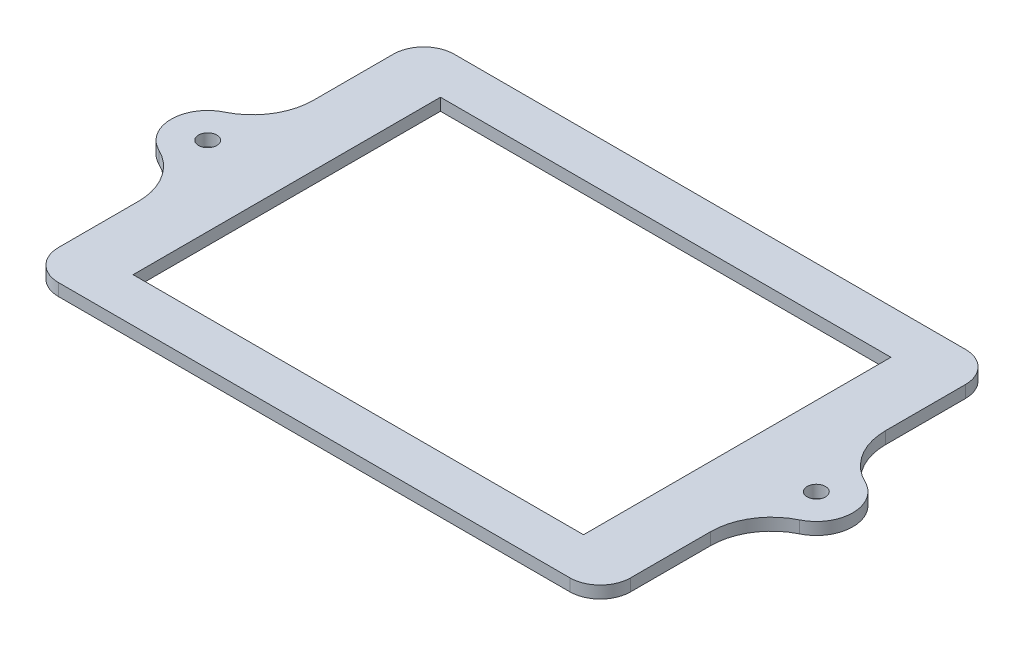
ISO-10303-21;
HEADER;
FILE_DESCRIPTION(('STEP AP214'),'2;1');
FILE_NAME('part.step','',(''),(''),'','','');
FILE_SCHEMA(('AUTOMOTIVE_DESIGN { 1 0 10303 214 1 1 1 1 }'));
ENDSEC;
DATA;
#1=APPLICATION_CONTEXT('core data for automotive mechanical design processes');
#2=APPLICATION_PROTOCOL_DEFINITION('international standard','automotive_design',2000,#1);
#3=PRODUCT_CONTEXT('',#1,'mechanical');
#4=PRODUCT('Part','Part','',(#3));
#5=PRODUCT_RELATED_PRODUCT_CATEGORY('part','',(#4));
#6=PRODUCT_DEFINITION_FORMATION('','',#4);
#7=PRODUCT_DEFINITION_CONTEXT('part definition',#1,'design');
#8=PRODUCT_DEFINITION('design','',#6,#7);
#9=PRODUCT_DEFINITION_SHAPE('','',#8);
#10=(LENGTH_UNIT() NAMED_UNIT(*) SI_UNIT(.MILLI.,.METRE.));
#11=(NAMED_UNIT(*) PLANE_ANGLE_UNIT() SI_UNIT($,.RADIAN.));
#12=(NAMED_UNIT(*) SI_UNIT($,.STERADIAN.) SOLID_ANGLE_UNIT());
#13=UNCERTAINTY_MEASURE_WITH_UNIT(LENGTH_MEASURE(1.E-05),#10,'distance_accuracy_value','');
#14=(GEOMETRIC_REPRESENTATION_CONTEXT(3) GLOBAL_UNCERTAINTY_ASSIGNED_CONTEXT((#13)) GLOBAL_UNIT_ASSIGNED_CONTEXT((#10,
#11,#12)) REPRESENTATION_CONTEXT('',''));
#15=CARTESIAN_POINT('',(0.,0.,0.));
#16=DIRECTION('',(0.,0.,1.));
#17=DIRECTION('',(1.,0.,0.));
#18=AXIS2_PLACEMENT_3D('',#15,#16,#17);
#19=CARTESIAN_POINT('',(-50.,2.,0.));
#20=DIRECTION('',(0.,1.,0.));
#21=DIRECTION('',(0.,0.,1.));
#22=AXIS2_PLACEMENT_3D('',#19,#20,#21);
#23=PLANE('',#22);
#24=CARTESIAN_POINT('',(-50.,2.,0.));
#25=DIRECTION('',(0.,1.,0.));
#26=DIRECTION('',(0.,0.,1.));
#27=AXIS2_PLACEMENT_3D('',#24,#25,#26);
#28=CIRCLE('',#27,1.5);
#29=CARTESIAN_POINT('',(-50.,2.,1.5));
#30=VERTEX_POINT('',#29);
#31=EDGE_CURVE('E204',#30,#30,#28,.T.);
#32=ORIENTED_EDGE('',*,*,#31,.F.);
#33=EDGE_LOOP('',(#32));
#34=FACE_BOUND('',#33,.T.);
#35=DIRECTION('',(1.,0.,0.));
#36=VECTOR('',#35,1.);
#37=CARTESIAN_POINT('',(-47.,2.,32.5));
#38=LINE('',#37,#36);
#39=CARTESIAN_POINT('',(-42.,2.,32.5));
#40=VERTEX_POINT('',#39);
#41=CARTESIAN_POINT('',(42.,2.,32.5));
#42=VERTEX_POINT('',#41);
#43=EDGE_CURVE('E224',#40,#42,#38,.T.);
#44=ORIENTED_EDGE('',*,*,#43,.T.);
#45=CARTESIAN_POINT('',(42.,2.,27.5));
#46=DIRECTION('',(0.,1.,0.));
#47=DIRECTION('',(0.,0.,1.));
#48=AXIS2_PLACEMENT_3D('',#45,#46,#47);
#49=CIRCLE('',#48,5.);
#50=CARTESIAN_POINT('',(47.,2.,27.5));
#51=VERTEX_POINT('',#50);
#52=EDGE_CURVE('E280',#42,#51,#49,.T.);
#53=ORIENTED_EDGE('',*,*,#52,.T.);
#54=DIRECTION('',(0.,0.,-1.));
#55=VECTOR('',#54,1.);
#56=CARTESIAN_POINT('',(47.,2.,5.19615242270663));
#57=LINE('',#56,#55);
#58=CARTESIAN_POINT('',(47.,2.,14.3874945699382));
#59=VERTEX_POINT('',#58);
#60=EDGE_CURVE('E227',#51,#59,#57,.T.);
#61=ORIENTED_EDGE('',*,*,#60,.T.);
#62=CARTESIAN_POINT('',(57.,2.,14.3874945699382));
#63=DIRECTION('',(0.,1.,0.));
#64=DIRECTION('',(0.,0.,1.));
#65=AXIS2_PLACEMENT_3D('',#62,#63,#64);
#66=CIRCLE('',#65,10.);
#67=CARTESIAN_POINT('',(52.625,2.,5.39531046372681));
#68=VERTEX_POINT('',#67);
#69=EDGE_CURVE('E11',#59,#68,#66,.F.);
#70=ORIENTED_EDGE('',*,*,#69,.T.);
#71=CARTESIAN_POINT('',(50.,2.,0.));
#72=DIRECTION('',(0.,1.,0.));
#73=DIRECTION('',(0.,0.,1.));
#74=AXIS2_PLACEMENT_3D('',#71,#72,#73);
#75=CIRCLE('',#74,6.);
#76=CARTESIAN_POINT('',(52.625,2.,-5.39531046372681));
#77=VERTEX_POINT('',#76);
#78=EDGE_CURVE('E229',#68,#77,#75,.T.);
#79=ORIENTED_EDGE('',*,*,#78,.T.);
#80=CARTESIAN_POINT('',(57.,2.,-14.3874945699382));
#81=DIRECTION('',(0.,1.,0.));
#82=DIRECTION('',(0.,0.,1.));
#83=AXIS2_PLACEMENT_3D('',#80,#81,#82);
#84=CIRCLE('',#83,10.);
#85=CARTESIAN_POINT('',(47.,2.,-14.3874945699382));
#86=VERTEX_POINT('',#85);
#87=EDGE_CURVE('E325',#77,#86,#84,.F.);
#88=ORIENTED_EDGE('',*,*,#87,.T.);
#89=DIRECTION('',(0.,0.,-1.));
#90=VECTOR('',#89,1.);
#91=CARTESIAN_POINT('',(47.,2.,-32.5));
#92=LINE('',#91,#90);
#93=CARTESIAN_POINT('',(47.,2.,-27.5));
#94=VERTEX_POINT('',#93);
#95=EDGE_CURVE('E232',#86,#94,#92,.T.);
#96=ORIENTED_EDGE('',*,*,#95,.T.);
#97=CARTESIAN_POINT('',(42.,2.,-27.5));
#98=DIRECTION('',(0.,1.,0.));
#99=DIRECTION('',(0.,0.,1.));
#100=AXIS2_PLACEMENT_3D('',#97,#98,#99);
#101=CIRCLE('',#100,5.);
#102=CARTESIAN_POINT('',(42.,2.,-32.5));
#103=VERTEX_POINT('',#102);
#104=EDGE_CURVE('E274',#94,#103,#101,.T.);
#105=ORIENTED_EDGE('',*,*,#104,.T.);
#106=DIRECTION('',(-1.,0.,0.));
#107=VECTOR('',#106,1.);
#108=CARTESIAN_POINT('',(-47.,2.,-32.5));
#109=LINE('',#108,#107);
#110=CARTESIAN_POINT('',(-42.,2.,-32.5));
#111=VERTEX_POINT('',#110);
#112=EDGE_CURVE('E234',#103,#111,#109,.T.);
#113=ORIENTED_EDGE('',*,*,#112,.T.);
#114=CARTESIAN_POINT('',(-42.,2.,-27.5));
#115=DIRECTION('',(0.,1.,0.));
#116=DIRECTION('',(0.,0.,1.));
#117=AXIS2_PLACEMENT_3D('',#114,#115,#116);
#118=CIRCLE('',#117,5.);
#119=CARTESIAN_POINT('',(-47.,2.,-27.5));
#120=VERTEX_POINT('',#119);
#121=EDGE_CURVE('E276',#111,#120,#118,.T.);
#122=ORIENTED_EDGE('',*,*,#121,.T.);
#123=DIRECTION('',(0.,0.,1.));
#124=VECTOR('',#123,1.);
#125=CARTESIAN_POINT('',(-47.,2.,-32.5));
#126=LINE('',#125,#124);
#127=CARTESIAN_POINT('',(-47.,2.,-14.3874945699382));
#128=VERTEX_POINT('',#127);
#129=EDGE_CURVE('E215',#120,#128,#126,.T.);
#130=ORIENTED_EDGE('',*,*,#129,.T.);
#131=CARTESIAN_POINT('',(-57.,2.,-14.3874945699382));
#132=DIRECTION('',(0.,1.,0.));
#133=DIRECTION('',(0.,0.,1.));
#134=AXIS2_PLACEMENT_3D('',#131,#132,#133);
#135=CIRCLE('',#134,10.);
#136=CARTESIAN_POINT('',(-52.625,2.,-5.39531046372681));
#137=VERTEX_POINT('',#136);
#138=EDGE_CURVE('E317',#128,#137,#135,.F.);
#139=ORIENTED_EDGE('',*,*,#138,.T.);
#140=CARTESIAN_POINT('',(-50.,2.,0.));
#141=DIRECTION('',(0.,1.,0.));
#142=DIRECTION('',(0.,0.,1.));
#143=AXIS2_PLACEMENT_3D('',#140,#141,#142);
#144=CIRCLE('',#143,6.);
#145=CARTESIAN_POINT('',(-52.625,2.,5.39531046372681));
#146=VERTEX_POINT('',#145);
#147=EDGE_CURVE('E218',#137,#146,#144,.T.);
#148=ORIENTED_EDGE('',*,*,#147,.T.);
#149=CARTESIAN_POINT('',(-57.,2.,14.3874945699382));
#150=DIRECTION('',(0.,1.,0.));
#151=DIRECTION('',(0.,0.,1.));
#152=AXIS2_PLACEMENT_3D('',#149,#150,#151);
#153=CIRCLE('',#152,10.);
#154=CARTESIAN_POINT('',(-47.,2.,14.3874945699382));
#155=VERTEX_POINT('',#154);
#156=EDGE_CURVE('E321',#146,#155,#153,.F.);
#157=ORIENTED_EDGE('',*,*,#156,.T.);
#158=DIRECTION('',(0.,0.,1.));
#159=VECTOR('',#158,1.);
#160=CARTESIAN_POINT('',(-47.,2.,5.19615242270663));
#161=LINE('',#160,#159);
#162=CARTESIAN_POINT('',(-47.,2.,27.5));
#163=VERTEX_POINT('',#162);
#164=EDGE_CURVE('E222',#155,#163,#161,.T.);
#165=ORIENTED_EDGE('',*,*,#164,.T.);
#166=CARTESIAN_POINT('',(-42.,2.,27.5));
#167=DIRECTION('',(0.,1.,0.));
#168=DIRECTION('',(0.,0.,1.));
#169=AXIS2_PLACEMENT_3D('',#166,#167,#168);
#170=CIRCLE('',#169,5.);
#171=EDGE_CURVE('E278',#163,#40,#170,.T.);
#172=ORIENTED_EDGE('',*,*,#171,.T.);
#173=EDGE_LOOP('',(#44,#53,#61,#70,#79,#88,#96,#105,#113,#122,#130,#139,#148,#157,#165,#172));
#174=FACE_BOUND('',#173,.T.);
#175=DIRECTION('',(1.,0.,0.));
#176=VECTOR('',#175,1.);
#177=CARTESIAN_POINT('',(-37.,2.,25.25));
#178=LINE('',#177,#176);
#179=CARTESIAN_POINT('',(-37.,2.,25.25));
#180=VERTEX_POINT('',#179);
#181=CARTESIAN_POINT('',(37.,2.,25.25));
#182=VERTEX_POINT('',#181);
#183=EDGE_CURVE('E181',#180,#182,#178,.T.);
#184=ORIENTED_EDGE('',*,*,#183,.F.);
#185=DIRECTION('',(0.,0.,1.));
#186=VECTOR('',#185,1.);
#187=CARTESIAN_POINT('',(-37.,2.,-25.25));
#188=LINE('',#187,#186);
#189=CARTESIAN_POINT('',(-37.,2.,-25.25));
#190=VERTEX_POINT('',#189);
#191=EDGE_CURVE('E171',#190,#180,#188,.T.);
#192=ORIENTED_EDGE('',*,*,#191,.F.);
#193=DIRECTION('',(-1.,0.,0.));
#194=VECTOR('',#193,1.);
#195=CARTESIAN_POINT('',(-37.,2.,-25.25));
#196=LINE('',#195,#194);
#197=CARTESIAN_POINT('',(37.,2.,-25.25));
#198=VERTEX_POINT('',#197);
#199=EDGE_CURVE('E197',#198,#190,#196,.T.);
#200=ORIENTED_EDGE('',*,*,#199,.F.);
#201=DIRECTION('',(0.,0.,-1.));
#202=VECTOR('',#201,1.);
#203=CARTESIAN_POINT('',(37.,2.,-25.25));
#204=LINE('',#203,#202);
#205=EDGE_CURVE('E195',#182,#198,#204,.T.);
#206=ORIENTED_EDGE('',*,*,#205,.F.);
#207=EDGE_LOOP('',(#184,#192,#200,#206));
#208=FACE_BOUND('',#207,.T.);
#209=CARTESIAN_POINT('',(50.,2.,0.));
#210=DIRECTION('',(0.,1.,0.));
#211=DIRECTION('',(0.,0.,1.));
#212=AXIS2_PLACEMENT_3D('',#209,#210,#211);
#213=CIRCLE('',#212,1.5);
#214=CARTESIAN_POINT('',(50.,2.,1.5));
#215=VERTEX_POINT('',#214);
#216=EDGE_CURVE('E598',#215,#215,#213,.T.);
#217=ORIENTED_EDGE('',*,*,#216,.F.);
#218=EDGE_LOOP('',(#217));
#219=FACE_BOUND('',#218,.T.);
#220=ADVANCED_FACE('F33',(#34,#174,#208,#219),#23,.T.);
#221=CARTESIAN_POINT('',(-50.,0.,0.));
#222=DIRECTION('',(0.,1.,0.));
#223=DIRECTION('',(0.,0.,1.));
#224=AXIS2_PLACEMENT_3D('',#221,#222,#223);
#225=PLANE('',#224);
#226=DIRECTION('',(0.,0.,-1.));
#227=VECTOR('',#226,1.);
#228=CARTESIAN_POINT('',(47.,0.,5.19615242270663));
#229=LINE('',#228,#227);
#230=CARTESIAN_POINT('',(47.,0.,27.5));
#231=VERTEX_POINT('',#230);
#232=CARTESIAN_POINT('',(47.,0.,14.3874945699382));
#233=VERTEX_POINT('',#232);
#234=EDGE_CURVE('E248',#231,#233,#229,.T.);
#235=ORIENTED_EDGE('',*,*,#234,.F.);
#236=CARTESIAN_POINT('',(42.,0.,27.5));
#237=DIRECTION('',(0.,1.,0.));
#238=DIRECTION('',(0.,0.,1.));
#239=AXIS2_PLACEMENT_3D('',#236,#237,#238);
#240=CIRCLE('',#239,5.);
#241=CARTESIAN_POINT('',(42.,0.,32.5));
#242=VERTEX_POINT('',#241);
#243=EDGE_CURVE('E267',#231,#242,#240,.F.);
#244=ORIENTED_EDGE('',*,*,#243,.T.);
#245=DIRECTION('',(1.,0.,0.));
#246=VECTOR('',#245,1.);
#247=CARTESIAN_POINT('',(-47.,0.,32.5));
#248=LINE('',#247,#246);
#249=CARTESIAN_POINT('',(-42.,0.,32.5));
#250=VERTEX_POINT('',#249);
#251=EDGE_CURVE('E245',#250,#242,#248,.T.);
#252=ORIENTED_EDGE('',*,*,#251,.F.);
#253=CARTESIAN_POINT('',(-42.,0.,27.5));
#254=DIRECTION('',(0.,1.,0.));
#255=DIRECTION('',(0.,0.,1.));
#256=AXIS2_PLACEMENT_3D('',#253,#254,#255);
#257=CIRCLE('',#256,5.);
#258=CARTESIAN_POINT('',(-47.,0.,27.5));
#259=VERTEX_POINT('',#258);
#260=EDGE_CURVE('E264',#250,#259,#257,.F.);
#261=ORIENTED_EDGE('',*,*,#260,.T.);
#262=DIRECTION('',(0.,0.,1.));
#263=VECTOR('',#262,1.);
#264=CARTESIAN_POINT('',(-47.,0.,5.19615242270663));
#265=LINE('',#264,#263);
#266=CARTESIAN_POINT('',(-47.,0.,14.3874945699382));
#267=VERTEX_POINT('',#266);
#268=EDGE_CURVE('E243',#267,#259,#265,.T.);
#269=ORIENTED_EDGE('',*,*,#268,.F.);
#270=CARTESIAN_POINT('',(-57.,0.,14.3874945699382));
#271=DIRECTION('',(0.,1.,0.));
#272=DIRECTION('',(0.,0.,1.));
#273=AXIS2_PLACEMENT_3D('',#270,#271,#272);
#274=CIRCLE('',#273,10.);
#275=CARTESIAN_POINT('',(-52.625,0.,5.39531046372681));
#276=VERTEX_POINT('',#275);
#277=EDGE_CURVE('E319',#267,#276,#274,.T.);
#278=ORIENTED_EDGE('',*,*,#277,.T.);
#279=CARTESIAN_POINT('',(-50.,0.,0.));
#280=DIRECTION('',(0.,1.,0.));
#281=DIRECTION('',(0.,0.,1.));
#282=AXIS2_PLACEMENT_3D('',#279,#280,#281);
#283=CIRCLE('',#282,6.);
#284=CARTESIAN_POINT('',(-52.625,0.,-5.39531046372681));
#285=VERTEX_POINT('',#284);
#286=EDGE_CURVE('E240',#285,#276,#283,.T.);
#287=ORIENTED_EDGE('',*,*,#286,.F.);
#288=CARTESIAN_POINT('',(-57.,0.,-14.3874945699382));
#289=DIRECTION('',(0.,1.,0.));
#290=DIRECTION('',(0.,0.,1.));
#291=AXIS2_PLACEMENT_3D('',#288,#289,#290);
#292=CIRCLE('',#291,10.);
#293=CARTESIAN_POINT('',(-47.,0.,-14.3874945699382));
#294=VERTEX_POINT('',#293);
#295=EDGE_CURVE('E315',#285,#294,#292,.T.);
#296=ORIENTED_EDGE('',*,*,#295,.T.);
#297=DIRECTION('',(0.,0.,1.));
#298=VECTOR('',#297,1.);
#299=CARTESIAN_POINT('',(-47.,0.,-32.5));
#300=LINE('',#299,#298);
#301=CARTESIAN_POINT('',(-47.,0.,-27.5));
#302=VERTEX_POINT('',#301);
#303=EDGE_CURVE('E189',#302,#294,#300,.T.);
#304=ORIENTED_EDGE('',*,*,#303,.F.);
#305=CARTESIAN_POINT('',(-42.,0.,-27.5));
#306=DIRECTION('',(0.,1.,0.));
#307=DIRECTION('',(0.,0.,1.));
#308=AXIS2_PLACEMENT_3D('',#305,#306,#307);
#309=CIRCLE('',#308,5.);
#310=CARTESIAN_POINT('',(-42.,0.,-32.5));
#311=VERTEX_POINT('',#310);
#312=EDGE_CURVE('E262',#302,#311,#309,.F.);
#313=ORIENTED_EDGE('',*,*,#312,.T.);
#314=DIRECTION('',(-1.,0.,0.));
#315=VECTOR('',#314,1.);
#316=CARTESIAN_POINT('',(-47.,0.,-32.5));
#317=LINE('',#316,#315);
#318=CARTESIAN_POINT('',(42.,0.,-32.5));
#319=VERTEX_POINT('',#318);
#320=EDGE_CURVE('E219',#319,#311,#317,.T.);
#321=ORIENTED_EDGE('',*,*,#320,.F.);
#322=CARTESIAN_POINT('',(42.,0.,-27.5));
#323=DIRECTION('',(0.,1.,0.));
#324=DIRECTION('',(0.,0.,1.));
#325=AXIS2_PLACEMENT_3D('',#322,#323,#324);
#326=CIRCLE('',#325,5.);
#327=CARTESIAN_POINT('',(47.,0.,-27.5));
#328=VERTEX_POINT('',#327);
#329=EDGE_CURVE('E259',#319,#328,#326,.F.);
#330=ORIENTED_EDGE('',*,*,#329,.T.);
#331=DIRECTION('',(0.,0.,-1.));
#332=VECTOR('',#331,1.);
#333=CARTESIAN_POINT('',(47.,0.,-32.5));
#334=LINE('',#333,#332);
#335=CARTESIAN_POINT('',(47.,0.,-14.3874945699382));
#336=VERTEX_POINT('',#335);
#337=EDGE_CURVE('E253',#336,#328,#334,.T.);
#338=ORIENTED_EDGE('',*,*,#337,.F.);
#339=CARTESIAN_POINT('',(57.,0.,-14.3874945699382));
#340=DIRECTION('',(0.,1.,0.));
#341=DIRECTION('',(0.,0.,1.));
#342=AXIS2_PLACEMENT_3D('',#339,#340,#341);
#343=CIRCLE('',#342,10.);
#344=CARTESIAN_POINT('',(52.625,0.,-5.39531046372681));
#345=VERTEX_POINT('',#344);
#346=EDGE_CURVE('E323',#336,#345,#343,.T.);
#347=ORIENTED_EDGE('',*,*,#346,.T.);
#348=CARTESIAN_POINT('',(50.,0.,0.));
#349=DIRECTION('',(0.,1.,0.));
#350=DIRECTION('',(0.,0.,1.));
#351=AXIS2_PLACEMENT_3D('',#348,#349,#350);
#352=CIRCLE('',#351,6.);
#353=CARTESIAN_POINT('',(52.625,0.,5.39531046372681));
#354=VERTEX_POINT('',#353);
#355=EDGE_CURVE('E250',#354,#345,#352,.T.);
#356=ORIENTED_EDGE('',*,*,#355,.F.);
#357=CARTESIAN_POINT('',(57.,0.,14.3874945699382));
#358=DIRECTION('',(0.,1.,0.));
#359=DIRECTION('',(0.,0.,1.));
#360=AXIS2_PLACEMENT_3D('',#357,#358,#359);
#361=CIRCLE('',#360,10.);
#362=EDGE_CURVE('E41',#354,#233,#361,.T.);
#363=ORIENTED_EDGE('',*,*,#362,.T.);
#364=EDGE_LOOP('',(#235,#244,#252,#261,#269,#278,#287,#296,#304,#313,#321,#330,#338,#347,#356,#363));
#365=FACE_BOUND('',#364,.T.);
#366=DIRECTION('',(0.,0.,1.));
#367=VECTOR('',#366,1.);
#368=CARTESIAN_POINT('',(-37.,0.,-25.25));
#369=LINE('',#368,#367);
#370=CARTESIAN_POINT('',(-37.,0.,-25.25));
#371=VERTEX_POINT('',#370);
#372=CARTESIAN_POINT('',(-37.,0.,25.25));
#373=VERTEX_POINT('',#372);
#374=EDGE_CURVE('E202',#371,#373,#369,.T.);
#375=ORIENTED_EDGE('',*,*,#374,.T.);
#376=DIRECTION('',(1.,0.,0.));
#377=VECTOR('',#376,1.);
#378=CARTESIAN_POINT('',(-37.,0.,25.25));
#379=LINE('',#378,#377);
#380=CARTESIAN_POINT('',(37.,0.,25.25));
#381=VERTEX_POINT('',#380);
#382=EDGE_CURVE('E188',#373,#381,#379,.T.);
#383=ORIENTED_EDGE('',*,*,#382,.T.);
#384=DIRECTION('',(0.,0.,-1.));
#385=VECTOR('',#384,1.);
#386=CARTESIAN_POINT('',(37.,0.,-25.25));
#387=LINE('',#386,#385);
#388=CARTESIAN_POINT('',(37.,0.,-25.25));
#389=VERTEX_POINT('',#388);
#390=EDGE_CURVE('E206',#381,#389,#387,.T.);
#391=ORIENTED_EDGE('',*,*,#390,.T.);
#392=DIRECTION('',(-1.,0.,0.));
#393=VECTOR('',#392,1.);
#394=CARTESIAN_POINT('',(-37.,0.,-25.25));
#395=LINE('',#394,#393);
#396=EDGE_CURVE('E182',#389,#371,#395,.T.);
#397=ORIENTED_EDGE('',*,*,#396,.T.);
#398=EDGE_LOOP('',(#375,#383,#391,#397));
#399=FACE_BOUND('',#398,.T.);
#400=CARTESIAN_POINT('',(-50.,0.,0.));
#401=DIRECTION('',(0.,1.,0.));
#402=DIRECTION('',(0.,0.,1.));
#403=AXIS2_PLACEMENT_3D('',#400,#401,#402);
#404=CIRCLE('',#403,1.5);
#405=CARTESIAN_POINT('',(-50.,0.,1.5));
#406=VERTEX_POINT('',#405);
#407=EDGE_CURVE('E604',#406,#406,#404,.T.);
#408=ORIENTED_EDGE('',*,*,#407,.T.);
#409=EDGE_LOOP('',(#408));
#410=FACE_BOUND('',#409,.T.);
#411=CARTESIAN_POINT('',(50.,0.,0.));
#412=DIRECTION('',(0.,1.,0.));
#413=DIRECTION('',(0.,0.,1.));
#414=AXIS2_PLACEMENT_3D('',#411,#412,#413);
#415=CIRCLE('',#414,1.5);
#416=CARTESIAN_POINT('',(50.,0.,1.5));
#417=VERTEX_POINT('',#416);
#418=EDGE_CURVE('E601',#417,#417,#415,.T.);
#419=ORIENTED_EDGE('',*,*,#418,.T.);
#420=EDGE_LOOP('',(#419));
#421=FACE_BOUND('',#420,.T.);
#422=ADVANCED_FACE('F339',(#365,#399,#410,#421),#225,.F.);
#423=CARTESIAN_POINT('',(-47.,2.,-32.5));
#424=DIRECTION('',(1.,0.,0.));
#425=DIRECTION('',(0.,0.,-1.));
#426=AXIS2_PLACEMENT_3D('',#423,#424,#425);
#427=PLANE('',#426);
#428=ORIENTED_EDGE('',*,*,#303,.T.);
#429=DIRECTION('',(0.,1.,0.));
#430=VECTOR('',#429,1.);
#431=CARTESIAN_POINT('',(-47.,2.,-14.3874945699382));
#432=LINE('',#431,#430);
#433=EDGE_CURVE('E301',#294,#128,#432,.T.);
#434=ORIENTED_EDGE('',*,*,#433,.T.);
#435=ORIENTED_EDGE('',*,*,#129,.F.);
#436=DIRECTION('',(0.,-1.,0.));
#437=VECTOR('',#436,1.);
#438=CARTESIAN_POINT('',(-47.,2.,-27.5));
#439=LINE('',#438,#437);
#440=EDGE_CURVE('E285',#120,#302,#439,.T.);
#441=ORIENTED_EDGE('',*,*,#440,.T.);
#442=EDGE_LOOP('',(#428,#434,#435,#441));
#443=FACE_BOUND('',#442,.T.);
#444=ADVANCED_FACE('F382',(#443),#427,.F.);
#445=CARTESIAN_POINT('',(-50.,2.,0.));
#446=DIRECTION('',(0.,-1.,0.));
#447=DIRECTION('',(0.,0.,-1.));
#448=AXIS2_PLACEMENT_3D('',#445,#446,#447);
#449=CYLINDRICAL_SURFACE('',#448,6.);
#450=ORIENTED_EDGE('',*,*,#147,.F.);
#451=DIRECTION('',(0.,-1.,0.));
#452=VECTOR('',#451,1.);
#453=CARTESIAN_POINT('',(-52.625,2.,-5.39531046372681));
#454=LINE('',#453,#452);
#455=EDGE_CURVE('E298',#137,#285,#454,.T.);
#456=ORIENTED_EDGE('',*,*,#455,.T.);
#457=ORIENTED_EDGE('',*,*,#286,.T.);
#458=DIRECTION('',(0.,-1.,0.));
#459=VECTOR('',#458,1.);
#460=CARTESIAN_POINT('',(-52.625,2.,5.39531046372681));
#461=LINE('',#460,#459);
#462=EDGE_CURVE('E296',#276,#146,#461,.F.);
#463=ORIENTED_EDGE('',*,*,#462,.T.);
#464=EDGE_LOOP('',(#450,#456,#457,#463));
#465=FACE_BOUND('',#464,.T.);
#466=ADVANCED_FACE('F373',(#465),#449,.T.);
#467=CARTESIAN_POINT('',(-47.,2.,5.19615242270663));
#468=DIRECTION('',(1.,0.,0.));
#469=DIRECTION('',(0.,0.,-1.));
#470=AXIS2_PLACEMENT_3D('',#467,#468,#469);
#471=PLANE('',#470);
#472=ORIENTED_EDGE('',*,*,#164,.F.);
#473=DIRECTION('',(0.,1.,0.));
#474=VECTOR('',#473,1.);
#475=CARTESIAN_POINT('',(-47.,0.,14.3874945699382));
#476=LINE('',#475,#474);
#477=EDGE_CURVE('E303',#155,#267,#476,.F.);
#478=ORIENTED_EDGE('',*,*,#477,.T.);
#479=ORIENTED_EDGE('',*,*,#268,.T.);
#480=DIRECTION('',(0.,-1.,0.));
#481=VECTOR('',#480,1.);
#482=CARTESIAN_POINT('',(-47.,2.,27.5));
#483=LINE('',#482,#481);
#484=EDGE_CURVE('E282',#259,#163,#483,.F.);
#485=ORIENTED_EDGE('',*,*,#484,.T.);
#486=EDGE_LOOP('',(#472,#478,#479,#485));
#487=FACE_BOUND('',#486,.T.);
#488=ADVANCED_FACE('F365',(#487),#471,.F.);
#489=CARTESIAN_POINT('',(-47.,2.,32.5));
#490=DIRECTION('',(0.,0.,-1.));
#491=DIRECTION('',(-1.,0.,0.));
#492=AXIS2_PLACEMENT_3D('',#489,#490,#491);
#493=PLANE('',#492);
#494=ORIENTED_EDGE('',*,*,#251,.T.);
#495=DIRECTION('',(0.,-1.,0.));
#496=VECTOR('',#495,1.);
#497=CARTESIAN_POINT('',(42.,2.,32.5));
#498=LINE('',#497,#496);
#499=EDGE_CURVE('E272',#242,#42,#498,.F.);
#500=ORIENTED_EDGE('',*,*,#499,.T.);
#501=ORIENTED_EDGE('',*,*,#43,.F.);
#502=DIRECTION('',(0.,-1.,0.));
#503=VECTOR('',#502,1.);
#504=CARTESIAN_POINT('',(-42.,2.,32.5));
#505=LINE('',#504,#503);
#506=EDGE_CURVE('E269',#40,#250,#505,.T.);
#507=ORIENTED_EDGE('',*,*,#506,.T.);
#508=EDGE_LOOP('',(#494,#500,#501,#507));
#509=FACE_BOUND('',#508,.T.);
#510=ADVANCED_FACE('F354',(#509),#493,.F.);
#511=CARTESIAN_POINT('',(47.,2.,5.19615242270663));
#512=DIRECTION('',(-1.,0.,0.));
#513=DIRECTION('',(0.,0.,1.));
#514=AXIS2_PLACEMENT_3D('',#511,#512,#513);
#515=PLANE('',#514);
#516=ORIENTED_EDGE('',*,*,#234,.T.);
#517=DIRECTION('',(0.,1.,0.));
#518=VECTOR('',#517,1.);
#519=CARTESIAN_POINT('',(47.,2.,14.3874945699382));
#520=LINE('',#519,#518);
#521=EDGE_CURVE('E54',#233,#59,#520,.T.);
#522=ORIENTED_EDGE('',*,*,#521,.T.);
#523=ORIENTED_EDGE('',*,*,#60,.F.);
#524=DIRECTION('',(0.,-1.,0.));
#525=VECTOR('',#524,1.);
#526=CARTESIAN_POINT('',(47.,2.,27.5));
#527=LINE('',#526,#525);
#528=EDGE_CURVE('E237',#51,#231,#527,.T.);
#529=ORIENTED_EDGE('',*,*,#528,.T.);
#530=EDGE_LOOP('',(#516,#522,#523,#529));
#531=FACE_BOUND('',#530,.T.);
#532=ADVANCED_FACE('F348',(#531),#515,.F.);
#533=CARTESIAN_POINT('',(50.,2.,0.));
#534=DIRECTION('',(0.,-1.,0.));
#535=DIRECTION('',(0.,0.,-1.));
#536=AXIS2_PLACEMENT_3D('',#533,#534,#535);
#537=CYLINDRICAL_SURFACE('',#536,6.);
#538=ORIENTED_EDGE('',*,*,#355,.T.);
#539=DIRECTION('',(0.,-1.,0.));
#540=VECTOR('',#539,1.);
#541=CARTESIAN_POINT('',(52.625,2.,-5.39531046372681));
#542=LINE('',#541,#540);
#543=EDGE_CURVE('E312',#345,#77,#542,.F.);
#544=ORIENTED_EDGE('',*,*,#543,.T.);
#545=ORIENTED_EDGE('',*,*,#78,.F.);
#546=DIRECTION('',(0.,-1.,0.));
#547=VECTOR('',#546,1.);
#548=CARTESIAN_POINT('',(52.625,2.,5.39531046372681));
#549=LINE('',#548,#547);
#550=EDGE_CURVE('E309',#68,#354,#549,.T.);
#551=ORIENTED_EDGE('',*,*,#550,.T.);
#552=EDGE_LOOP('',(#538,#544,#545,#551));
#553=FACE_BOUND('',#552,.T.);
#554=ADVANCED_FACE('F342',(#553),#537,.T.);
#555=CARTESIAN_POINT('',(47.,2.,-32.5));
#556=DIRECTION('',(-1.,0.,0.));
#557=DIRECTION('',(0.,0.,1.));
#558=AXIS2_PLACEMENT_3D('',#555,#556,#557);
#559=PLANE('',#558);
#560=ORIENTED_EDGE('',*,*,#95,.F.);
#561=DIRECTION('',(0.,1.,0.));
#562=VECTOR('',#561,1.);
#563=CARTESIAN_POINT('',(47.,0.,-14.3874945699382));
#564=LINE('',#563,#562);
#565=EDGE_CURVE('E306',#86,#336,#564,.F.);
#566=ORIENTED_EDGE('',*,*,#565,.T.);
#567=ORIENTED_EDGE('',*,*,#337,.T.);
#568=DIRECTION('',(0.,-1.,0.));
#569=VECTOR('',#568,1.);
#570=CARTESIAN_POINT('',(47.,2.,-27.5));
#571=LINE('',#570,#569);
#572=EDGE_CURVE('E293',#328,#94,#571,.F.);
#573=ORIENTED_EDGE('',*,*,#572,.T.);
#574=EDGE_LOOP('',(#560,#566,#567,#573));
#575=FACE_BOUND('',#574,.T.);
#576=ADVANCED_FACE('F334',(#575),#559,.F.);
#577=CARTESIAN_POINT('',(-47.,2.,-32.5));
#578=DIRECTION('',(0.,0.,1.));
#579=DIRECTION('',(1.,0.,0.));
#580=AXIS2_PLACEMENT_3D('',#577,#578,#579);
#581=PLANE('',#580);
#582=ORIENTED_EDGE('',*,*,#320,.T.);
#583=DIRECTION('',(0.,-1.,0.));
#584=VECTOR('',#583,1.);
#585=CARTESIAN_POINT('',(-42.,2.,-32.5));
#586=LINE('',#585,#584);
#587=EDGE_CURVE('E291',#311,#111,#586,.F.);
#588=ORIENTED_EDGE('',*,*,#587,.T.);
#589=ORIENTED_EDGE('',*,*,#112,.F.);
#590=DIRECTION('',(0.,-1.,0.));
#591=VECTOR('',#590,1.);
#592=CARTESIAN_POINT('',(42.,2.,-32.5));
#593=LINE('',#592,#591);
#594=EDGE_CURVE('E288',#103,#319,#593,.T.);
#595=ORIENTED_EDGE('',*,*,#594,.T.);
#596=EDGE_LOOP('',(#582,#588,#589,#595));
#597=FACE_BOUND('',#596,.T.);
#598=ADVANCED_FACE('F390',(#597),#581,.F.);
#599=CARTESIAN_POINT('',(-37.,2.,-25.25));
#600=DIRECTION('',(1.,0.,0.));
#601=DIRECTION('',(0.,0.,-1.));
#602=AXIS2_PLACEMENT_3D('',#599,#600,#601);
#603=PLANE('',#602);
#604=ORIENTED_EDGE('',*,*,#374,.F.);
#605=DIRECTION('',(0.,-1.,0.));
#606=VECTOR('',#605,1.);
#607=CARTESIAN_POINT('',(-37.,2.,-25.25));
#608=LINE('',#607,#606);
#609=EDGE_CURVE('E177',#190,#371,#608,.T.);
#610=ORIENTED_EDGE('',*,*,#609,.F.);
#611=ORIENTED_EDGE('',*,*,#191,.T.);
#612=DIRECTION('',(0.,-1.,0.));
#613=VECTOR('',#612,1.);
#614=CARTESIAN_POINT('',(-37.,2.,25.25));
#615=LINE('',#614,#613);
#616=EDGE_CURVE('E174',#180,#373,#615,.T.);
#617=ORIENTED_EDGE('',*,*,#616,.T.);
#618=EDGE_LOOP('',(#604,#610,#611,#617));
#619=FACE_BOUND('',#618,.T.);
#620=ADVANCED_FACE('F173',(#619),#603,.T.);
#621=CARTESIAN_POINT('',(-37.,2.,25.25));
#622=DIRECTION('',(0.,0.,-1.));
#623=DIRECTION('',(-1.,0.,0.));
#624=AXIS2_PLACEMENT_3D('',#621,#622,#623);
#625=PLANE('',#624);
#626=ORIENTED_EDGE('',*,*,#382,.F.);
#627=ORIENTED_EDGE('',*,*,#616,.F.);
#628=ORIENTED_EDGE('',*,*,#183,.T.);
#629=DIRECTION('',(0.,-1.,0.));
#630=VECTOR('',#629,1.);
#631=CARTESIAN_POINT('',(37.,2.,25.25));
#632=LINE('',#631,#630);
#633=EDGE_CURVE('E190',#182,#381,#632,.T.);
#634=ORIENTED_EDGE('',*,*,#633,.T.);
#635=EDGE_LOOP('',(#626,#627,#628,#634));
#636=FACE_BOUND('',#635,.T.);
#637=ADVANCED_FACE('F185',(#636),#625,.T.);
#638=CARTESIAN_POINT('',(37.,2.,-25.25));
#639=DIRECTION('',(-1.,0.,0.));
#640=DIRECTION('',(0.,0.,1.));
#641=AXIS2_PLACEMENT_3D('',#638,#639,#640);
#642=PLANE('',#641);
#643=ORIENTED_EDGE('',*,*,#390,.F.);
#644=ORIENTED_EDGE('',*,*,#633,.F.);
#645=ORIENTED_EDGE('',*,*,#205,.T.);
#646=DIRECTION('',(0.,-1.,0.));
#647=VECTOR('',#646,1.);
#648=CARTESIAN_POINT('',(37.,2.,-25.25));
#649=LINE('',#648,#647);
#650=EDGE_CURVE('E212',#198,#389,#649,.T.);
#651=ORIENTED_EDGE('',*,*,#650,.T.);
#652=EDGE_LOOP('',(#643,#644,#645,#651));
#653=FACE_BOUND('',#652,.T.);
#654=ADVANCED_FACE('F540',(#653),#642,.T.);
#655=CARTESIAN_POINT('',(-37.,2.,-25.25));
#656=DIRECTION('',(0.,0.,1.));
#657=DIRECTION('',(1.,0.,0.));
#658=AXIS2_PLACEMENT_3D('',#655,#656,#657);
#659=PLANE('',#658);
#660=ORIENTED_EDGE('',*,*,#396,.F.);
#661=ORIENTED_EDGE('',*,*,#650,.F.);
#662=ORIENTED_EDGE('',*,*,#199,.T.);
#663=ORIENTED_EDGE('',*,*,#609,.T.);
#664=EDGE_LOOP('',(#660,#661,#662,#663));
#665=FACE_BOUND('',#664,.T.);
#666=ADVANCED_FACE('F546',(#665),#659,.T.);
#667=CARTESIAN_POINT('',(-50.,2.,0.));
#668=DIRECTION('',(0.,-1.,0.));
#669=DIRECTION('',(0.,0.,-1.));
#670=AXIS2_PLACEMENT_3D('',#667,#668,#669);
#671=CYLINDRICAL_SURFACE('',#670,1.5);
#672=ORIENTED_EDGE('',*,*,#31,.T.);
#673=EDGE_LOOP('',(#672));
#674=FACE_BOUND('',#673,.T.);
#675=ORIENTED_EDGE('',*,*,#407,.F.);
#676=EDGE_LOOP('',(#675));
#677=FACE_BOUND('',#676,.T.);
#678=ADVANCED_FACE('F554',(#674,#677),#671,.F.);
#679=CARTESIAN_POINT('',(50.,2.,0.));
#680=DIRECTION('',(0.,-1.,0.));
#681=DIRECTION('',(0.,0.,-1.));
#682=AXIS2_PLACEMENT_3D('',#679,#680,#681);
#683=CYLINDRICAL_SURFACE('',#682,1.5);
#684=ORIENTED_EDGE('',*,*,#216,.T.);
#685=EDGE_LOOP('',(#684));
#686=FACE_BOUND('',#685,.T.);
#687=ORIENTED_EDGE('',*,*,#418,.F.);
#688=EDGE_LOOP('',(#687));
#689=FACE_BOUND('',#688,.T.);
#690=ADVANCED_FACE('F432',(#686,#689),#683,.F.);
#691=CARTESIAN_POINT('',(42.,2.,27.5));
#692=DIRECTION('',(0.,-1.,0.));
#693=DIRECTION('',(0.,0.,-1.));
#694=AXIS2_PLACEMENT_3D('',#691,#692,#693);
#695=CYLINDRICAL_SURFACE('',#694,5.);
#696=ORIENTED_EDGE('',*,*,#52,.F.);
#697=ORIENTED_EDGE('',*,*,#499,.F.);
#698=ORIENTED_EDGE('',*,*,#243,.F.);
#699=ORIENTED_EDGE('',*,*,#528,.F.);
#700=EDGE_LOOP('',(#696,#697,#698,#699));
#701=FACE_BOUND('',#700,.T.);
#702=ADVANCED_FACE('F350',(#701),#695,.T.);
#703=CARTESIAN_POINT('',(-42.,2.,27.5));
#704=DIRECTION('',(0.,-1.,0.));
#705=DIRECTION('',(0.,0.,-1.));
#706=AXIS2_PLACEMENT_3D('',#703,#704,#705);
#707=CYLINDRICAL_SURFACE('',#706,5.);
#708=ORIENTED_EDGE('',*,*,#171,.F.);
#709=ORIENTED_EDGE('',*,*,#484,.F.);
#710=ORIENTED_EDGE('',*,*,#260,.F.);
#711=ORIENTED_EDGE('',*,*,#506,.F.);
#712=EDGE_LOOP('',(#708,#709,#710,#711));
#713=FACE_BOUND('',#712,.T.);
#714=ADVANCED_FACE('F359',(#713),#707,.T.);
#715=CARTESIAN_POINT('',(-42.,2.,-27.5));
#716=DIRECTION('',(0.,-1.,0.));
#717=DIRECTION('',(0.,0.,-1.));
#718=AXIS2_PLACEMENT_3D('',#715,#716,#717);
#719=CYLINDRICAL_SURFACE('',#718,5.);
#720=ORIENTED_EDGE('',*,*,#121,.F.);
#721=ORIENTED_EDGE('',*,*,#587,.F.);
#722=ORIENTED_EDGE('',*,*,#312,.F.);
#723=ORIENTED_EDGE('',*,*,#440,.F.);
#724=EDGE_LOOP('',(#720,#721,#722,#723));
#725=FACE_BOUND('',#724,.T.);
#726=ADVANCED_FACE('F386',(#725),#719,.T.);
#727=CARTESIAN_POINT('',(42.,2.,-27.5));
#728=DIRECTION('',(0.,-1.,0.));
#729=DIRECTION('',(0.,0.,-1.));
#730=AXIS2_PLACEMENT_3D('',#727,#728,#729);
#731=CYLINDRICAL_SURFACE('',#730,5.);
#732=ORIENTED_EDGE('',*,*,#104,.F.);
#733=ORIENTED_EDGE('',*,*,#572,.F.);
#734=ORIENTED_EDGE('',*,*,#329,.F.);
#735=ORIENTED_EDGE('',*,*,#594,.F.);
#736=EDGE_LOOP('',(#732,#733,#734,#735));
#737=FACE_BOUND('',#736,.T.);
#738=ADVANCED_FACE('F394',(#737),#731,.T.);
#739=CARTESIAN_POINT('',(-57.,2.,-14.3874945699382));
#740=DIRECTION('',(0.,-1.,0.));
#741=DIRECTION('',(0.,0.,-1.));
#742=AXIS2_PLACEMENT_3D('',#739,#740,#741);
#743=CYLINDRICAL_SURFACE('',#742,10.);
#744=ORIENTED_EDGE('',*,*,#138,.F.);
#745=ORIENTED_EDGE('',*,*,#433,.F.);
#746=ORIENTED_EDGE('',*,*,#295,.F.);
#747=ORIENTED_EDGE('',*,*,#455,.F.);
#748=EDGE_LOOP('',(#744,#745,#746,#747));
#749=FACE_BOUND('',#748,.T.);
#750=ADVANCED_FACE('F379',(#749),#743,.F.);
#751=CARTESIAN_POINT('',(-57.,2.,14.3874945699382));
#752=DIRECTION('',(0.,-1.,0.));
#753=DIRECTION('',(0.,0.,-1.));
#754=AXIS2_PLACEMENT_3D('',#751,#752,#753);
#755=CYLINDRICAL_SURFACE('',#754,10.);
#756=ORIENTED_EDGE('',*,*,#156,.F.);
#757=ORIENTED_EDGE('',*,*,#462,.F.);
#758=ORIENTED_EDGE('',*,*,#277,.F.);
#759=ORIENTED_EDGE('',*,*,#477,.F.);
#760=EDGE_LOOP('',(#756,#757,#758,#759));
#761=FACE_BOUND('',#760,.T.);
#762=ADVANCED_FACE('F369',(#761),#755,.F.);
#763=CARTESIAN_POINT('',(57.,2.,-14.3874945699382));
#764=DIRECTION('',(0.,-1.,0.));
#765=DIRECTION('',(0.,0.,-1.));
#766=AXIS2_PLACEMENT_3D('',#763,#764,#765);
#767=CYLINDRICAL_SURFACE('',#766,10.);
#768=ORIENTED_EDGE('',*,*,#87,.F.);
#769=ORIENTED_EDGE('',*,*,#543,.F.);
#770=ORIENTED_EDGE('',*,*,#346,.F.);
#771=ORIENTED_EDGE('',*,*,#565,.F.);
#772=EDGE_LOOP('',(#768,#769,#770,#771));
#773=FACE_BOUND('',#772,.T.);
#774=ADVANCED_FACE('F338',(#773),#767,.F.);
#775=CARTESIAN_POINT('',(57.,2.,14.3874945699382));
#776=DIRECTION('',(0.,-1.,0.));
#777=DIRECTION('',(0.,0.,-1.));
#778=AXIS2_PLACEMENT_3D('',#775,#776,#777);
#779=CYLINDRICAL_SURFACE('',#778,10.);
#780=ORIENTED_EDGE('',*,*,#69,.F.);
#781=ORIENTED_EDGE('',*,*,#521,.F.);
#782=ORIENTED_EDGE('',*,*,#362,.F.);
#783=ORIENTED_EDGE('',*,*,#550,.F.);
#784=EDGE_LOOP('',(#780,#781,#782,#783));
#785=FACE_BOUND('',#784,.T.);
#786=ADVANCED_FACE('F35',(#785),#779,.F.);
#787=CLOSED_SHELL('',(#220,#422,#444,#466,#488,#510,#532,#554,#576,#598,#620,#637,#654,#666,
#678,#690,#702,#714,#726,#738,#750,#762,#774,#786));
#788=MANIFOLD_SOLID_BREP('B2',#787);
#789=ADVANCED_BREP_SHAPE_REPRESENTATION('',(#18,#788),#14);
#790=SHAPE_DEFINITION_REPRESENTATION(#9,#789);
ENDSEC;
END-ISO-10303-21;
